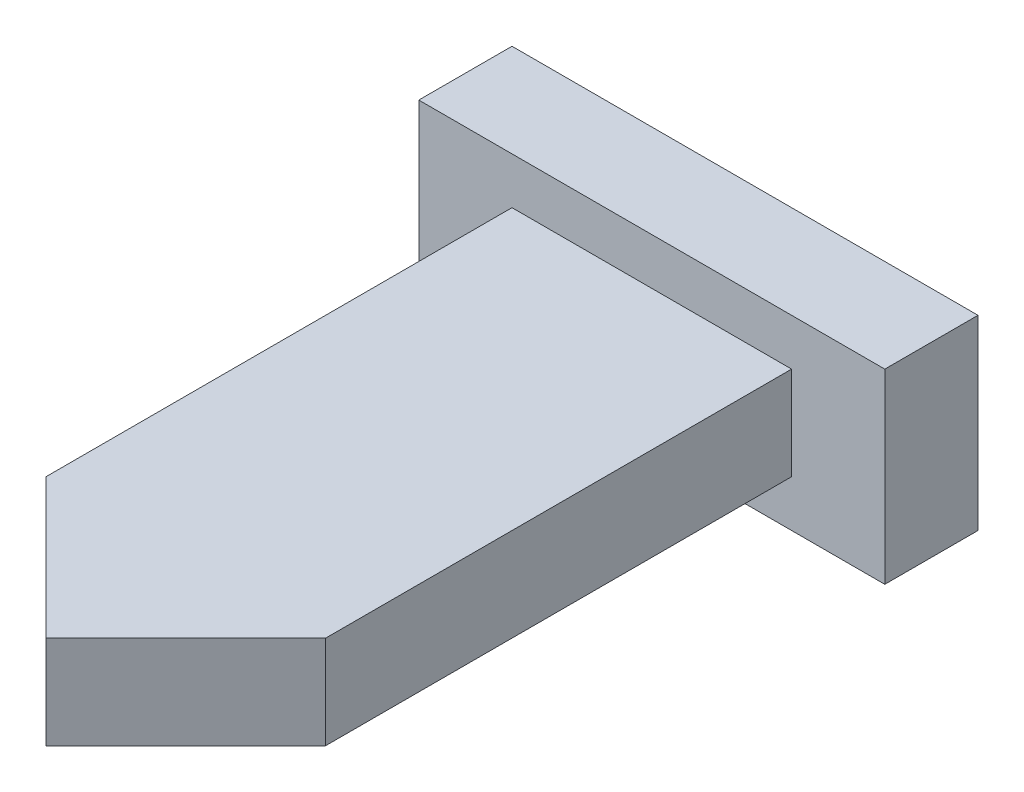
ISO-10303-21;
HEADER;
FILE_DESCRIPTION(('STEP AP214'),'2;1');
FILE_NAME('part.step','',(''),(''),'','','');
FILE_SCHEMA(('AUTOMOTIVE_DESIGN { 1 0 10303 214 1 1 1 1 }'));
ENDSEC;
DATA;
#1=APPLICATION_CONTEXT('core data for automotive mechanical design processes');
#2=APPLICATION_PROTOCOL_DEFINITION('international standard','automotive_design',2000,#1);
#3=PRODUCT_CONTEXT('',#1,'mechanical');
#4=PRODUCT('Part','Part','',(#3));
#5=PRODUCT_RELATED_PRODUCT_CATEGORY('part','',(#4));
#6=PRODUCT_DEFINITION_FORMATION('','',#4);
#7=PRODUCT_DEFINITION_CONTEXT('part definition',#1,'design');
#8=PRODUCT_DEFINITION('design','',#6,#7);
#9=PRODUCT_DEFINITION_SHAPE('','',#8);
#10=(LENGTH_UNIT() NAMED_UNIT(*) SI_UNIT(.MILLI.,.METRE.));
#11=(NAMED_UNIT(*) PLANE_ANGLE_UNIT() SI_UNIT($,.RADIAN.));
#12=(NAMED_UNIT(*) SI_UNIT($,.STERADIAN.) SOLID_ANGLE_UNIT());
#13=UNCERTAINTY_MEASURE_WITH_UNIT(LENGTH_MEASURE(1.E-05),#10,'distance_accuracy_value','');
#14=(GEOMETRIC_REPRESENTATION_CONTEXT(3) GLOBAL_UNCERTAINTY_ASSIGNED_CONTEXT((#13)) GLOBAL_UNIT_ASSIGNED_CONTEXT((#10,
#11,#12)) REPRESENTATION_CONTEXT('',''));
#15=CARTESIAN_POINT('',(0.,0.,0.));
#16=DIRECTION('',(0.,0.,1.));
#17=DIRECTION('',(1.,0.,0.));
#18=AXIS2_PLACEMENT_3D('',#15,#16,#17);
#19=CARTESIAN_POINT('',(0.,15.,15.));
#20=DIRECTION('',(0.,0.,-1.));
#21=DIRECTION('',(-1.,0.,0.));
#22=AXIS2_PLACEMENT_3D('',#19,#20,#21);
#23=PLANE('',#22);
#24=DIRECTION('',(1.,0.,0.));
#25=VECTOR('',#24,1.);
#26=CARTESIAN_POINT('',(0.,-15.,15.));
#27=LINE('',#26,#25);
#28=CARTESIAN_POINT('',(-37.5,-15.,15.));
#29=VERTEX_POINT('',#28);
#30=CARTESIAN_POINT('',(37.5,-15.,15.));
#31=VERTEX_POINT('',#30);
#32=EDGE_CURVE('E131',#29,#31,#27,.T.);
#33=ORIENTED_EDGE('',*,*,#32,.T.);
#34=DIRECTION('',(0.,-1.,0.));
#35=VECTOR('',#34,1.);
#36=CARTESIAN_POINT('',(37.5,15.,15.));
#37=LINE('',#36,#35);
#38=CARTESIAN_POINT('',(37.5,15.,15.));
#39=VERTEX_POINT('',#38);
#40=EDGE_CURVE('E11',#39,#31,#37,.T.);
#41=ORIENTED_EDGE('',*,*,#40,.F.);
#42=DIRECTION('',(1.,0.,0.));
#43=VECTOR('',#42,1.);
#44=CARTESIAN_POINT('',(0.,15.,15.));
#45=LINE('',#44,#43);
#46=CARTESIAN_POINT('',(-37.5,15.,15.));
#47=VERTEX_POINT('',#46);
#48=EDGE_CURVE('E170',#47,#39,#45,.T.);
#49=ORIENTED_EDGE('',*,*,#48,.F.);
#50=DIRECTION('',(0.,-1.,0.));
#51=VECTOR('',#50,1.);
#52=CARTESIAN_POINT('',(-37.5,15.,15.));
#53=LINE('',#52,#51);
#54=EDGE_CURVE('E176',#47,#29,#53,.T.);
#55=ORIENTED_EDGE('',*,*,#54,.T.);
#56=EDGE_LOOP('',(#33,#41,#49,#55));
#57=FACE_BOUND('',#56,.T.);
#58=DIRECTION('',(1.,0.,0.));
#59=VECTOR('',#58,1.);
#60=CARTESIAN_POINT('',(0.,-7.5,15.));
#61=LINE('',#60,#59);
#62=CARTESIAN_POINT('',(-22.5,-7.5,15.));
#63=VERTEX_POINT('',#62);
#64=CARTESIAN_POINT('',(22.5,-7.5,15.));
#65=VERTEX_POINT('',#64);
#66=EDGE_CURVE('E55',#63,#65,#61,.T.);
#67=ORIENTED_EDGE('',*,*,#66,.F.);
#68=DIRECTION('',(0.,-1.,0.));
#69=VECTOR('',#68,1.);
#70=CARTESIAN_POINT('',(-22.5,7.5,15.));
#71=LINE('',#70,#69);
#72=CARTESIAN_POINT('',(-22.5,7.5,15.));
#73=VERTEX_POINT('',#72);
#74=EDGE_CURVE('E164',#73,#63,#71,.T.);
#75=ORIENTED_EDGE('',*,*,#74,.F.);
#76=DIRECTION('',(1.,0.,0.));
#77=VECTOR('',#76,1.);
#78=CARTESIAN_POINT('',(0.,7.5,15.));
#79=LINE('',#78,#77);
#80=CARTESIAN_POINT('',(22.5,7.5,15.));
#81=VERTEX_POINT('',#80);
#82=EDGE_CURVE('E152',#73,#81,#79,.T.);
#83=ORIENTED_EDGE('',*,*,#82,.T.);
#84=DIRECTION('',(0.,-1.,0.));
#85=VECTOR('',#84,1.);
#86=CARTESIAN_POINT('',(22.5,7.5,15.));
#87=LINE('',#86,#85);
#88=EDGE_CURVE('E166',#81,#65,#87,.T.);
#89=ORIENTED_EDGE('',*,*,#88,.T.);
#90=EDGE_LOOP('',(#67,#75,#83,#89));
#91=FACE_BOUND('',#90,.T.);
#92=ADVANCED_FACE('F41',(#57,#91),#23,.F.);
#93=CARTESIAN_POINT('',(37.5,15.,0.));
#94=DIRECTION('',(-1.,0.,0.));
#95=DIRECTION('',(0.,0.,1.));
#96=AXIS2_PLACEMENT_3D('',#93,#94,#95);
#97=PLANE('',#96);
#98=DIRECTION('',(0.,0.,-1.));
#99=VECTOR('',#98,1.);
#100=CARTESIAN_POINT('',(37.5,-15.,0.));
#101=LINE('',#100,#99);
#102=CARTESIAN_POINT('',(37.5,-15.,0.));
#103=VERTEX_POINT('',#102);
#104=EDGE_CURVE('E179',#31,#103,#101,.T.);
#105=ORIENTED_EDGE('',*,*,#104,.T.);
#106=DIRECTION('',(0.,-1.,0.));
#107=VECTOR('',#106,1.);
#108=CARTESIAN_POINT('',(37.5,15.,0.));
#109=LINE('',#108,#107);
#110=CARTESIAN_POINT('',(37.5,15.,0.));
#111=VERTEX_POINT('',#110);
#112=EDGE_CURVE('E48',#111,#103,#109,.T.);
#113=ORIENTED_EDGE('',*,*,#112,.F.);
#114=DIRECTION('',(0.,0.,-1.));
#115=VECTOR('',#114,1.);
#116=CARTESIAN_POINT('',(37.5,15.,0.));
#117=LINE('',#116,#115);
#118=EDGE_CURVE('E92',#39,#111,#117,.T.);
#119=ORIENTED_EDGE('',*,*,#118,.F.);
#120=ORIENTED_EDGE('',*,*,#40,.T.);
#121=EDGE_LOOP('',(#105,#113,#119,#120));
#122=FACE_BOUND('',#121,.T.);
#123=ADVANCED_FACE('F208',(#122),#97,.F.);
#124=CARTESIAN_POINT('',(0.,15.,0.));
#125=DIRECTION('',(0.,0.,1.));
#126=DIRECTION('',(1.,0.,0.));
#127=AXIS2_PLACEMENT_3D('',#124,#125,#126);
#128=PLANE('',#127);
#129=DIRECTION('',(-1.,0.,0.));
#130=VECTOR('',#129,1.);
#131=CARTESIAN_POINT('',(0.,-15.,0.));
#132=LINE('',#131,#130);
#133=CARTESIAN_POINT('',(-37.5,-15.,0.));
#134=VERTEX_POINT('',#133);
#135=EDGE_CURVE('E181',#103,#134,#132,.T.);
#136=ORIENTED_EDGE('',*,*,#135,.T.);
#137=DIRECTION('',(0.,-1.,0.));
#138=VECTOR('',#137,1.);
#139=CARTESIAN_POINT('',(-37.5,15.,0.));
#140=LINE('',#139,#138);
#141=CARTESIAN_POINT('',(-37.5,15.,0.));
#142=VERTEX_POINT('',#141);
#143=EDGE_CURVE('E185',#142,#134,#140,.T.);
#144=ORIENTED_EDGE('',*,*,#143,.F.);
#145=DIRECTION('',(-1.,0.,0.));
#146=VECTOR('',#145,1.);
#147=CARTESIAN_POINT('',(0.,15.,0.));
#148=LINE('',#147,#146);
#149=EDGE_CURVE('E173',#111,#142,#148,.T.);
#150=ORIENTED_EDGE('',*,*,#149,.F.);
#151=ORIENTED_EDGE('',*,*,#112,.T.);
#152=EDGE_LOOP('',(#136,#144,#150,#151));
#153=FACE_BOUND('',#152,.T.);
#154=ADVANCED_FACE('F190',(#153),#128,.F.);
#155=CARTESIAN_POINT('',(-37.5,15.,0.));
#156=DIRECTION('',(1.,0.,0.));
#157=DIRECTION('',(0.,0.,-1.));
#158=AXIS2_PLACEMENT_3D('',#155,#156,#157);
#159=PLANE('',#158);
#160=DIRECTION('',(0.,0.,1.));
#161=VECTOR('',#160,1.);
#162=CARTESIAN_POINT('',(-37.5,-15.,0.));
#163=LINE('',#162,#161);
#164=EDGE_CURVE('E85',#134,#29,#163,.T.);
#165=ORIENTED_EDGE('',*,*,#164,.T.);
#166=ORIENTED_EDGE('',*,*,#54,.F.);
#167=DIRECTION('',(0.,0.,1.));
#168=VECTOR('',#167,1.);
#169=CARTESIAN_POINT('',(-37.5,15.,0.));
#170=LINE('',#169,#168);
#171=EDGE_CURVE('E64',#142,#47,#170,.T.);
#172=ORIENTED_EDGE('',*,*,#171,.F.);
#173=ORIENTED_EDGE('',*,*,#143,.T.);
#174=EDGE_LOOP('',(#165,#166,#172,#173));
#175=FACE_BOUND('',#174,.T.);
#176=ADVANCED_FACE('F199',(#175),#159,.F.);
#177=CARTESIAN_POINT('',(0.,15.,0.));
#178=DIRECTION('',(0.,1.,0.));
#179=DIRECTION('',(0.,0.,1.));
#180=AXIS2_PLACEMENT_3D('',#177,#178,#179);
#181=PLANE('',#180);
#182=ORIENTED_EDGE('',*,*,#48,.T.);
#183=ORIENTED_EDGE('',*,*,#118,.T.);
#184=ORIENTED_EDGE('',*,*,#149,.T.);
#185=ORIENTED_EDGE('',*,*,#171,.T.);
#186=EDGE_LOOP('',(#182,#183,#184,#185));
#187=FACE_BOUND('',#186,.T.);
#188=ADVANCED_FACE('F201',(#187),#181,.T.);
#189=CARTESIAN_POINT('',(0.,-15.,0.));
#190=DIRECTION('',(0.,1.,0.));
#191=DIRECTION('',(0.,0.,1.));
#192=AXIS2_PLACEMENT_3D('',#189,#190,#191);
#193=PLANE('',#192);
#194=ORIENTED_EDGE('',*,*,#32,.F.);
#195=ORIENTED_EDGE('',*,*,#164,.F.);
#196=ORIENTED_EDGE('',*,*,#135,.F.);
#197=ORIENTED_EDGE('',*,*,#104,.F.);
#198=EDGE_LOOP('',(#194,#195,#196,#197));
#199=FACE_BOUND('',#198,.T.);
#200=ADVANCED_FACE('F194',(#199),#193,.F.);
#201=CARTESIAN_POINT('',(-56.25,7.5,56.25));
#202=DIRECTION('',(-0.707106781186547,0.,0.707106781186548));
#203=DIRECTION('',(0.707106781186548,0.,0.707106781186547));
#204=AXIS2_PLACEMENT_3D('',#201,#202,#203);
#205=PLANE('',#204);
#206=DIRECTION('',(-0.707106781186548,0.,-0.707106781186547));
#207=VECTOR('',#206,1.);
#208=CARTESIAN_POINT('',(-56.25,-7.5,56.25));
#209=LINE('',#208,#207);
#210=CARTESIAN_POINT('',(0.,-7.5,112.5));
#211=VERTEX_POINT('',#210);
#212=CARTESIAN_POINT('',(-22.5,-7.5,90.));
#213=VERTEX_POINT('',#212);
#214=EDGE_CURVE('E128',#211,#213,#209,.T.);
#215=ORIENTED_EDGE('',*,*,#214,.F.);
#216=DIRECTION('',(0.,-1.,0.));
#217=VECTOR('',#216,1.);
#218=CARTESIAN_POINT('',(0.,7.5,112.5));
#219=LINE('',#218,#217);
#220=CARTESIAN_POINT('',(0.,7.5,112.5));
#221=VERTEX_POINT('',#220);
#222=EDGE_CURVE('E122',#221,#211,#219,.T.);
#223=ORIENTED_EDGE('',*,*,#222,.F.);
#224=DIRECTION('',(-0.707106781186548,0.,-0.707106781186547));
#225=VECTOR('',#224,1.);
#226=CARTESIAN_POINT('',(-56.25,7.5,56.25));
#227=LINE('',#226,#225);
#228=CARTESIAN_POINT('',(-22.5,7.5,90.));
#229=VERTEX_POINT('',#228);
#230=EDGE_CURVE('E126',#221,#229,#227,.T.);
#231=ORIENTED_EDGE('',*,*,#230,.T.);
#232=DIRECTION('',(0.,-1.,0.));
#233=VECTOR('',#232,1.);
#234=CARTESIAN_POINT('',(-22.5,7.5,90.));
#235=LINE('',#234,#233);
#236=EDGE_CURVE('E156',#229,#213,#235,.T.);
#237=ORIENTED_EDGE('',*,*,#236,.T.);
#238=EDGE_LOOP('',(#215,#223,#231,#237));
#239=FACE_BOUND('',#238,.T.);
#240=ADVANCED_FACE('F124',(#239),#205,.T.);
#241=CARTESIAN_POINT('',(56.25,7.5,56.25));
#242=DIRECTION('',(-0.707106781186547,0.,-0.707106781186548));
#243=DIRECTION('',(-0.707106781186548,0.,0.707106781186547));
#244=AXIS2_PLACEMENT_3D('',#241,#242,#243);
#245=PLANE('',#244);
#246=DIRECTION('',(0.707106781186548,0.,-0.707106781186547));
#247=VECTOR('',#246,1.);
#248=CARTESIAN_POINT('',(56.25,-7.5,56.25));
#249=LINE('',#248,#247);
#250=CARTESIAN_POINT('',(22.5,-7.5,90.));
#251=VERTEX_POINT('',#250);
#252=EDGE_CURVE('E158',#211,#251,#249,.T.);
#253=ORIENTED_EDGE('',*,*,#252,.T.);
#254=DIRECTION('',(0.,-1.,0.));
#255=VECTOR('',#254,1.);
#256=CARTESIAN_POINT('',(22.5,7.5,90.));
#257=LINE('',#256,#255);
#258=CARTESIAN_POINT('',(22.5,7.5,90.));
#259=VERTEX_POINT('',#258);
#260=EDGE_CURVE('E132',#259,#251,#257,.T.);
#261=ORIENTED_EDGE('',*,*,#260,.F.);
#262=DIRECTION('',(0.707106781186548,0.,-0.707106781186547));
#263=VECTOR('',#262,1.);
#264=CARTESIAN_POINT('',(56.25,7.5,56.25));
#265=LINE('',#264,#263);
#266=EDGE_CURVE('E135',#221,#259,#265,.T.);
#267=ORIENTED_EDGE('',*,*,#266,.F.);
#268=ORIENTED_EDGE('',*,*,#222,.T.);
#269=EDGE_LOOP('',(#253,#261,#267,#268));
#270=FACE_BOUND('',#269,.T.);
#271=ADVANCED_FACE('F136',(#270),#245,.F.);
#272=CARTESIAN_POINT('',(22.5,7.5,0.));
#273=DIRECTION('',(-1.,0.,0.));
#274=DIRECTION('',(0.,0.,1.));
#275=AXIS2_PLACEMENT_3D('',#272,#273,#274);
#276=PLANE('',#275);
#277=DIRECTION('',(0.,0.,-1.));
#278=VECTOR('',#277,1.);
#279=CARTESIAN_POINT('',(22.5,-7.5,0.));
#280=LINE('',#279,#278);
#281=EDGE_CURVE('E160',#251,#65,#280,.T.);
#282=ORIENTED_EDGE('',*,*,#281,.T.);
#283=ORIENTED_EDGE('',*,*,#88,.F.);
#284=DIRECTION('',(0.,0.,-1.));
#285=VECTOR('',#284,1.);
#286=CARTESIAN_POINT('',(22.5,7.5,0.));
#287=LINE('',#286,#285);
#288=EDGE_CURVE('E140',#259,#81,#287,.T.);
#289=ORIENTED_EDGE('',*,*,#288,.F.);
#290=ORIENTED_EDGE('',*,*,#260,.T.);
#291=EDGE_LOOP('',(#282,#283,#289,#290));
#292=FACE_BOUND('',#291,.T.);
#293=ADVANCED_FACE('F264',(#292),#276,.F.);
#294=CARTESIAN_POINT('',(-22.5,7.5,0.));
#295=DIRECTION('',(1.,0.,0.));
#296=DIRECTION('',(0.,0.,-1.));
#297=AXIS2_PLACEMENT_3D('',#294,#295,#296);
#298=PLANE('',#297);
#299=DIRECTION('',(0.,0.,1.));
#300=VECTOR('',#299,1.);
#301=CARTESIAN_POINT('',(-22.5,-7.5,0.));
#302=LINE('',#301,#300);
#303=EDGE_CURVE('E146',#63,#213,#302,.T.);
#304=ORIENTED_EDGE('',*,*,#303,.T.);
#305=ORIENTED_EDGE('',*,*,#236,.F.);
#306=DIRECTION('',(0.,0.,1.));
#307=VECTOR('',#306,1.);
#308=CARTESIAN_POINT('',(-22.5,7.5,0.));
#309=LINE('',#308,#307);
#310=EDGE_CURVE('E144',#73,#229,#309,.T.);
#311=ORIENTED_EDGE('',*,*,#310,.F.);
#312=ORIENTED_EDGE('',*,*,#74,.T.);
#313=EDGE_LOOP('',(#304,#305,#311,#312));
#314=FACE_BOUND('',#313,.T.);
#315=ADVANCED_FACE('F273',(#314),#298,.F.);
#316=CARTESIAN_POINT('',(0.,7.5,0.));
#317=DIRECTION('',(0.,1.,0.));
#318=DIRECTION('',(0.,0.,1.));
#319=AXIS2_PLACEMENT_3D('',#316,#317,#318);
#320=PLANE('',#319);
#321=ORIENTED_EDGE('',*,*,#230,.F.);
#322=ORIENTED_EDGE('',*,*,#266,.T.);
#323=ORIENTED_EDGE('',*,*,#288,.T.);
#324=ORIENTED_EDGE('',*,*,#82,.F.);
#325=ORIENTED_EDGE('',*,*,#310,.T.);
#326=EDGE_LOOP('',(#321,#322,#323,#324,#325));
#327=FACE_BOUND('',#326,.T.);
#328=ADVANCED_FACE('F142',(#327),#320,.T.);
#329=CARTESIAN_POINT('',(0.,-7.5,0.));
#330=DIRECTION('',(0.,1.,0.));
#331=DIRECTION('',(0.,0.,1.));
#332=AXIS2_PLACEMENT_3D('',#329,#330,#331);
#333=PLANE('',#332);
#334=ORIENTED_EDGE('',*,*,#214,.T.);
#335=ORIENTED_EDGE('',*,*,#303,.F.);
#336=ORIENTED_EDGE('',*,*,#66,.T.);
#337=ORIENTED_EDGE('',*,*,#281,.F.);
#338=ORIENTED_EDGE('',*,*,#252,.F.);
#339=EDGE_LOOP('',(#334,#335,#336,#337,#338));
#340=FACE_BOUND('',#339,.T.);
#341=ADVANCED_FACE('F292',(#340),#333,.F.);
#342=CLOSED_SHELL('',(#92,#123,#154,#176,#188,#200,#240,#271,#293,#315,#328,#341));
#343=MANIFOLD_SOLID_BREP('B2',#342);
#344=ADVANCED_BREP_SHAPE_REPRESENTATION('',(#18,#343),#14);
#345=SHAPE_DEFINITION_REPRESENTATION(#9,#344);
ENDSEC;
END-ISO-10303-21;
